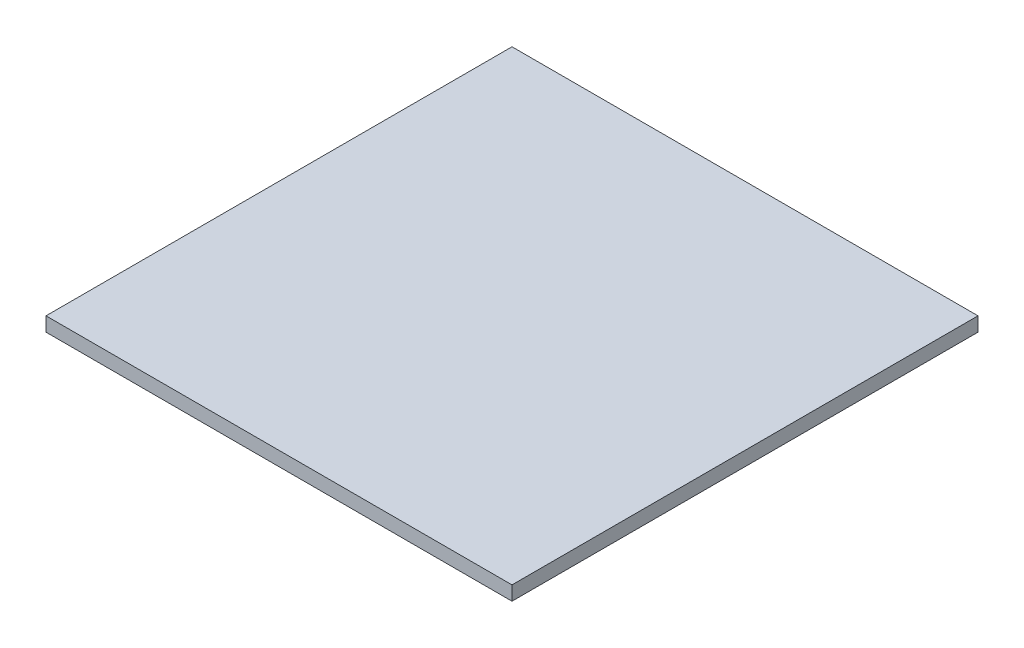
ISO-10303-21;
HEADER;
FILE_DESCRIPTION(('STEP AP214'),'2;1');
FILE_NAME('part.step','',(''),(''),'','','');
FILE_SCHEMA(('AUTOMOTIVE_DESIGN { 1 0 10303 214 1 1 1 1 }'));
ENDSEC;
DATA;
#1=APPLICATION_CONTEXT('core data for automotive mechanical design processes');
#2=APPLICATION_PROTOCOL_DEFINITION('international standard','automotive_design',2000,#1);
#3=PRODUCT_CONTEXT('',#1,'mechanical');
#4=PRODUCT('Part','Part','',(#3));
#5=PRODUCT_RELATED_PRODUCT_CATEGORY('part','',(#4));
#6=PRODUCT_DEFINITION_FORMATION('','',#4);
#7=PRODUCT_DEFINITION_CONTEXT('part definition',#1,'design');
#8=PRODUCT_DEFINITION('design','',#6,#7);
#9=PRODUCT_DEFINITION_SHAPE('','',#8);
#10=(LENGTH_UNIT() NAMED_UNIT(*) SI_UNIT(.MILLI.,.METRE.));
#11=(NAMED_UNIT(*) PLANE_ANGLE_UNIT() SI_UNIT($,.RADIAN.));
#12=(NAMED_UNIT(*) SI_UNIT($,.STERADIAN.) SOLID_ANGLE_UNIT());
#13=UNCERTAINTY_MEASURE_WITH_UNIT(LENGTH_MEASURE(1.E-05),#10,'distance_accuracy_value','');
#14=(GEOMETRIC_REPRESENTATION_CONTEXT(3) GLOBAL_UNCERTAINTY_ASSIGNED_CONTEXT((#13)) GLOBAL_UNIT_ASSIGNED_CONTEXT((#10,
#11,#12)) REPRESENTATION_CONTEXT('',''));
#15=CARTESIAN_POINT('',(0.,0.,0.));
#16=DIRECTION('',(0.,0.,1.));
#17=DIRECTION('',(1.,0.,0.));
#18=AXIS2_PLACEMENT_3D('',#15,#16,#17);
#19=CARTESIAN_POINT('',(-263.,16.,0.));
#20=DIRECTION('',(1.,0.,0.));
#21=DIRECTION('',(0.,0.,-1.));
#22=AXIS2_PLACEMENT_3D('',#19,#20,#21);
#23=PLANE('',#22);
#24=DIRECTION('',(0.,0.,1.));
#25=VECTOR('',#24,1.);
#26=CARTESIAN_POINT('',(-263.,0.,0.));
#27=LINE('',#26,#25);
#28=CARTESIAN_POINT('',(-263.,0.,0.));
#29=VERTEX_POINT('',#28);
#30=CARTESIAN_POINT('',(-263.,0.,526.));
#31=VERTEX_POINT('',#30);
#32=EDGE_CURVE('E95',#29,#31,#27,.T.);
#33=ORIENTED_EDGE('',*,*,#32,.T.);
#34=DIRECTION('',(0.,-1.,0.));
#35=VECTOR('',#34,1.);
#36=CARTESIAN_POINT('',(-263.,16.,526.));
#37=LINE('',#36,#35);
#38=CARTESIAN_POINT('',(-263.,16.,526.));
#39=VERTEX_POINT('',#38);
#40=EDGE_CURVE('E11',#39,#31,#37,.T.);
#41=ORIENTED_EDGE('',*,*,#40,.F.);
#42=DIRECTION('',(0.,0.,1.));
#43=VECTOR('',#42,1.);
#44=CARTESIAN_POINT('',(-263.,16.,0.));
#45=LINE('',#44,#43);
#46=CARTESIAN_POINT('',(-263.,16.,0.));
#47=VERTEX_POINT('',#46);
#48=EDGE_CURVE('E83',#47,#39,#45,.T.);
#49=ORIENTED_EDGE('',*,*,#48,.F.);
#50=DIRECTION('',(0.,-1.,0.));
#51=VECTOR('',#50,1.);
#52=CARTESIAN_POINT('',(-263.,16.,0.));
#53=LINE('',#52,#51);
#54=EDGE_CURVE('E91',#47,#29,#53,.T.);
#55=ORIENTED_EDGE('',*,*,#54,.T.);
#56=EDGE_LOOP('',(#33,#41,#49,#55));
#57=FACE_BOUND('',#56,.T.);
#58=ADVANCED_FACE('F32',(#57),#23,.F.);
#59=CARTESIAN_POINT('',(-263.,16.,526.));
#60=DIRECTION('',(0.,0.,-1.));
#61=DIRECTION('',(-1.,0.,0.));
#62=AXIS2_PLACEMENT_3D('',#59,#60,#61);
#63=PLANE('',#62);
#64=DIRECTION('',(1.,0.,0.));
#65=VECTOR('',#64,1.);
#66=CARTESIAN_POINT('',(-263.,0.,526.));
#67=LINE('',#66,#65);
#68=CARTESIAN_POINT('',(263.,0.,526.));
#69=VERTEX_POINT('',#68);
#70=EDGE_CURVE('E87',#31,#69,#67,.T.);
#71=ORIENTED_EDGE('',*,*,#70,.T.);
#72=DIRECTION('',(0.,-1.,0.));
#73=VECTOR('',#72,1.);
#74=CARTESIAN_POINT('',(263.,16.,526.));
#75=LINE('',#74,#73);
#76=CARTESIAN_POINT('',(263.,16.,526.));
#77=VERTEX_POINT('',#76);
#78=EDGE_CURVE('E40',#77,#69,#75,.T.);
#79=ORIENTED_EDGE('',*,*,#78,.F.);
#80=DIRECTION('',(1.,0.,0.));
#81=VECTOR('',#80,1.);
#82=CARTESIAN_POINT('',(-263.,16.,526.));
#83=LINE('',#82,#81);
#84=EDGE_CURVE('E78',#39,#77,#83,.T.);
#85=ORIENTED_EDGE('',*,*,#84,.F.);
#86=ORIENTED_EDGE('',*,*,#40,.T.);
#87=EDGE_LOOP('',(#71,#79,#85,#86));
#88=FACE_BOUND('',#87,.T.);
#89=ADVANCED_FACE('F86',(#88),#63,.F.);
#90=CARTESIAN_POINT('',(263.,16.,0.));
#91=DIRECTION('',(-1.,0.,0.));
#92=DIRECTION('',(0.,0.,1.));
#93=AXIS2_PLACEMENT_3D('',#90,#91,#92);
#94=PLANE('',#93);
#95=DIRECTION('',(0.,0.,-1.));
#96=VECTOR('',#95,1.);
#97=CARTESIAN_POINT('',(263.,0.,0.));
#98=LINE('',#97,#96);
#99=CARTESIAN_POINT('',(263.,0.,0.));
#100=VERTEX_POINT('',#99);
#101=EDGE_CURVE('E65',#69,#100,#98,.T.);
#102=ORIENTED_EDGE('',*,*,#101,.T.);
#103=DIRECTION('',(0.,-1.,0.));
#104=VECTOR('',#103,1.);
#105=CARTESIAN_POINT('',(263.,16.,0.));
#106=LINE('',#105,#104);
#107=CARTESIAN_POINT('',(263.,16.,0.));
#108=VERTEX_POINT('',#107);
#109=EDGE_CURVE('E88',#108,#100,#106,.T.);
#110=ORIENTED_EDGE('',*,*,#109,.F.);
#111=DIRECTION('',(0.,0.,-1.));
#112=VECTOR('',#111,1.);
#113=CARTESIAN_POINT('',(263.,16.,0.));
#114=LINE('',#113,#112);
#115=EDGE_CURVE('E81',#77,#108,#114,.T.);
#116=ORIENTED_EDGE('',*,*,#115,.F.);
#117=ORIENTED_EDGE('',*,*,#78,.T.);
#118=EDGE_LOOP('',(#102,#110,#116,#117));
#119=FACE_BOUND('',#118,.T.);
#120=ADVANCED_FACE('F89',(#119),#94,.F.);
#121=CARTESIAN_POINT('',(-263.,16.,0.));
#122=DIRECTION('',(0.,0.,1.));
#123=DIRECTION('',(1.,0.,0.));
#124=AXIS2_PLACEMENT_3D('',#121,#122,#123);
#125=PLANE('',#124);
#126=DIRECTION('',(-1.,0.,0.));
#127=VECTOR('',#126,1.);
#128=CARTESIAN_POINT('',(-263.,0.,0.));
#129=LINE('',#128,#127);
#130=EDGE_CURVE('E71',#100,#29,#129,.T.);
#131=ORIENTED_EDGE('',*,*,#130,.T.);
#132=ORIENTED_EDGE('',*,*,#54,.F.);
#133=DIRECTION('',(-1.,0.,0.));
#134=VECTOR('',#133,1.);
#135=CARTESIAN_POINT('',(-263.,16.,0.));
#136=LINE('',#135,#134);
#137=EDGE_CURVE('E48',#108,#47,#136,.T.);
#138=ORIENTED_EDGE('',*,*,#137,.F.);
#139=ORIENTED_EDGE('',*,*,#109,.T.);
#140=EDGE_LOOP('',(#131,#132,#138,#139));
#141=FACE_BOUND('',#140,.T.);
#142=ADVANCED_FACE('F102',(#141),#125,.F.);
#143=CARTESIAN_POINT('',(-263.,16.,526.));
#144=DIRECTION('',(0.,1.,0.));
#145=DIRECTION('',(0.,0.,1.));
#146=AXIS2_PLACEMENT_3D('',#143,#144,#145);
#147=PLANE('',#146);
#148=ORIENTED_EDGE('',*,*,#48,.T.);
#149=ORIENTED_EDGE('',*,*,#84,.T.);
#150=ORIENTED_EDGE('',*,*,#115,.T.);
#151=ORIENTED_EDGE('',*,*,#137,.T.);
#152=EDGE_LOOP('',(#148,#149,#150,#151));
#153=FACE_BOUND('',#152,.T.);
#154=ADVANCED_FACE('F79',(#153),#147,.T.);
#155=CARTESIAN_POINT('',(-263.,0.,526.));
#156=DIRECTION('',(0.,1.,0.));
#157=DIRECTION('',(0.,0.,1.));
#158=AXIS2_PLACEMENT_3D('',#155,#156,#157);
#159=PLANE('',#158);
#160=ORIENTED_EDGE('',*,*,#32,.F.);
#161=ORIENTED_EDGE('',*,*,#130,.F.);
#162=ORIENTED_EDGE('',*,*,#101,.F.);
#163=ORIENTED_EDGE('',*,*,#70,.F.);
#164=EDGE_LOOP('',(#160,#161,#162,#163));
#165=FACE_BOUND('',#164,.T.);
#166=ADVANCED_FACE('F105',(#165),#159,.F.);
#167=CLOSED_SHELL('',(#58,#89,#120,#142,#154,#166));
#168=MANIFOLD_SOLID_BREP('B2',#167);
#169=ADVANCED_BREP_SHAPE_REPRESENTATION('',(#18,#168),#14);
#170=SHAPE_DEFINITION_REPRESENTATION(#9,#169);
ENDSEC;
END-ISO-10303-21;
